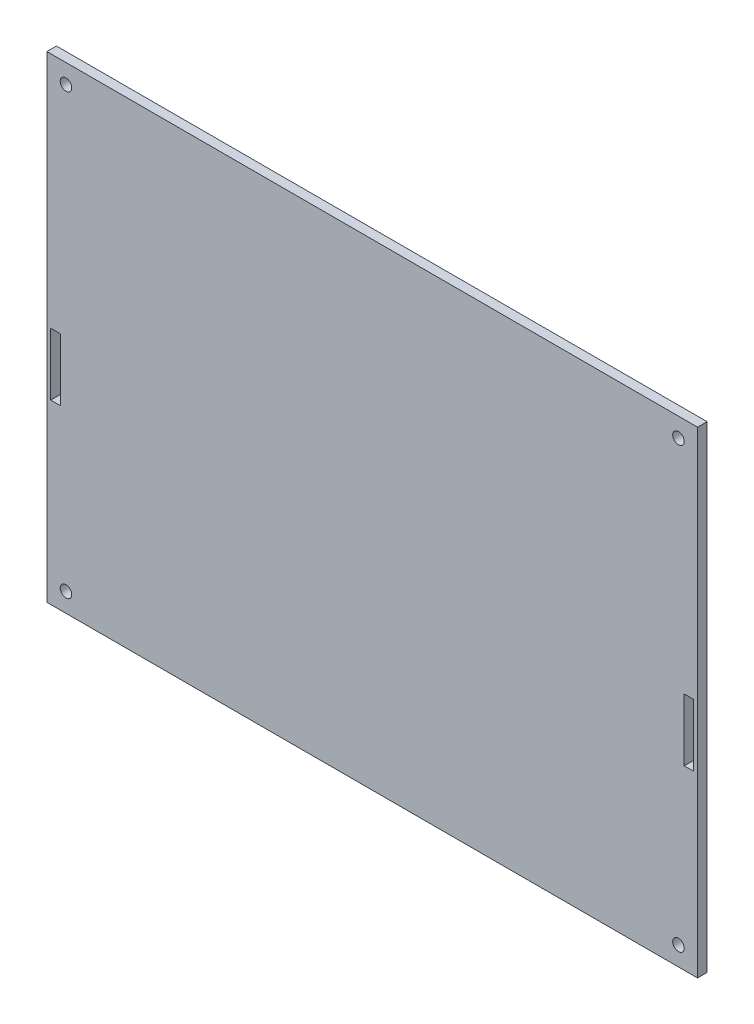
ISO-10303-21;
HEADER;
FILE_DESCRIPTION(('STEP AP214'),'2;1');
FILE_NAME('part.step','',(''),(''),'','','');
FILE_SCHEMA(('AUTOMOTIVE_DESIGN { 1 0 10303 214 1 1 1 1 }'));
ENDSEC;
DATA;
#1=APPLICATION_CONTEXT('core data for automotive mechanical design processes');
#2=APPLICATION_PROTOCOL_DEFINITION('international standard','automotive_design',2000,#1);
#3=PRODUCT_CONTEXT('',#1,'mechanical');
#4=PRODUCT('Part','Part','',(#3));
#5=PRODUCT_RELATED_PRODUCT_CATEGORY('part','',(#4));
#6=PRODUCT_DEFINITION_FORMATION('','',#4);
#7=PRODUCT_DEFINITION_CONTEXT('part definition',#1,'design');
#8=PRODUCT_DEFINITION('design','',#6,#7);
#9=PRODUCT_DEFINITION_SHAPE('','',#8);
#10=(LENGTH_UNIT() NAMED_UNIT(*) SI_UNIT(.MILLI.,.METRE.));
#11=(NAMED_UNIT(*) PLANE_ANGLE_UNIT() SI_UNIT($,.RADIAN.));
#12=(NAMED_UNIT(*) SI_UNIT($,.STERADIAN.) SOLID_ANGLE_UNIT());
#13=UNCERTAINTY_MEASURE_WITH_UNIT(LENGTH_MEASURE(1.E-05),#10,'distance_accuracy_value','');
#14=(GEOMETRIC_REPRESENTATION_CONTEXT(3) GLOBAL_UNCERTAINTY_ASSIGNED_CONTEXT((#13)) GLOBAL_UNIT_ASSIGNED_CONTEXT((#10,
#11,#12)) REPRESENTATION_CONTEXT('',''));
#15=CARTESIAN_POINT('',(0.,0.,0.));
#16=DIRECTION('',(0.,0.,1.));
#17=DIRECTION('',(1.,0.,0.));
#18=AXIS2_PLACEMENT_3D('',#15,#16,#17);
#19=CARTESIAN_POINT('',(0.,0.,5.));
#20=DIRECTION('',(0.,0.,-1.));
#21=DIRECTION('',(-1.,0.,0.));
#22=AXIS2_PLACEMENT_3D('',#19,#20,#21);
#23=PLANE('',#22);
#24=CARTESIAN_POINT('',(321.000000000002,-1.90060640836709E-12,5.));
#25=DIRECTION('',(0.,0.,1.));
#26=DIRECTION('',(1.,0.,0.));
#27=AXIS2_PLACEMENT_3D('',#24,#25,#26);
#28=CIRCLE('',#27,3.02500000000001);
#29=CARTESIAN_POINT('',(324.025000000002,-1.90060640836709E-12,5.));
#30=VERTEX_POINT('',#29);
#31=EDGE_CURVE('E165',#30,#30,#28,.T.);
#32=ORIENTED_EDGE('',*,*,#31,.F.);
#33=EDGE_LOOP('',(#32));
#34=FACE_BOUND('',#33,.T.);
#35=CARTESIAN_POINT('',(0.,0.,5.));
#36=DIRECTION('',(0.,0.,1.));
#37=DIRECTION('',(1.,0.,0.));
#38=AXIS2_PLACEMENT_3D('',#35,#36,#37);
#39=CIRCLE('',#38,3.025);
#40=CARTESIAN_POINT('',(3.025,0.,5.));
#41=VERTEX_POINT('',#40);
#42=EDGE_CURVE('E171',#41,#41,#39,.T.);
#43=ORIENTED_EDGE('',*,*,#42,.F.);
#44=EDGE_LOOP('',(#43));
#45=FACE_BOUND('',#44,.T.);
#46=CARTESIAN_POINT('',(0.,-229.999999999997,5.));
#47=DIRECTION('',(0.,0.,1.));
#48=DIRECTION('',(1.,0.,0.));
#49=AXIS2_PLACEMENT_3D('',#46,#47,#48);
#50=CIRCLE('',#49,3.025);
#51=CARTESIAN_POINT('',(3.02500000000003,-229.999999999997,5.));
#52=VERTEX_POINT('',#51);
#53=EDGE_CURVE('E177',#52,#52,#50,.T.);
#54=ORIENTED_EDGE('',*,*,#53,.F.);
#55=EDGE_LOOP('',(#54));
#56=FACE_BOUND('',#55,.T.);
#57=DIRECTION('',(-1.,0.,0.));
#58=VECTOR('',#57,1.);
#59=CARTESIAN_POINT('',(324.,-114.60000000018,5.));
#60=LINE('',#59,#58);
#61=CARTESIAN_POINT('',(329.,-114.60000000018,5.));
#62=VERTEX_POINT('',#61);
#63=CARTESIAN_POINT('',(324.,-114.60000000018,5.));
#64=VERTEX_POINT('',#63);
#65=EDGE_CURVE('E183',#62,#64,#60,.T.);
#66=ORIENTED_EDGE('',*,*,#65,.F.);
#67=DIRECTION('',(0.,1.,0.));
#68=VECTOR('',#67,1.);
#69=CARTESIAN_POINT('',(329.,-114.60000000018,5.));
#70=LINE('',#69,#68);
#71=CARTESIAN_POINT('',(329.,-147.205939298235,5.));
#72=VERTEX_POINT('',#71);
#73=EDGE_CURVE('E191',#72,#62,#70,.T.);
#74=ORIENTED_EDGE('',*,*,#73,.F.);
#75=DIRECTION('',(1.,0.,0.));
#76=VECTOR('',#75,1.);
#77=CARTESIAN_POINT('',(324.,-147.205939298235,5.));
#78=LINE('',#77,#76);
#79=CARTESIAN_POINT('',(324.,-147.205939298235,5.));
#80=VERTEX_POINT('',#79);
#81=EDGE_CURVE('E188',#80,#72,#78,.T.);
#82=ORIENTED_EDGE('',*,*,#81,.F.);
#83=DIRECTION('',(0.,-1.,0.));
#84=VECTOR('',#83,1.);
#85=CARTESIAN_POINT('',(324.,-114.60000000018,5.));
#86=LINE('',#85,#84);
#87=EDGE_CURVE('E185',#64,#80,#86,.T.);
#88=ORIENTED_EDGE('',*,*,#87,.F.);
#89=EDGE_LOOP('',(#66,#74,#82,#88));
#90=FACE_BOUND('',#89,.T.);
#91=DIRECTION('',(0.,1.,0.));
#92=VECTOR('',#91,1.);
#93=CARTESIAN_POINT('',(331.,10.0000000000033,5.));
#94=LINE('',#93,#92);
#95=CARTESIAN_POINT('',(331.,-239.999999999997,5.));
#96=VERTEX_POINT('',#95);
#97=CARTESIAN_POINT('',(331.,10.0000000000033,5.));
#98=VERTEX_POINT('',#97);
#99=EDGE_CURVE('E214',#96,#98,#94,.T.);
#100=ORIENTED_EDGE('',*,*,#99,.T.);
#101=DIRECTION('',(-1.,0.,0.));
#102=VECTOR('',#101,1.);
#103=CARTESIAN_POINT('',(331.,10.0000000000033,5.));
#104=LINE('',#103,#102);
#105=CARTESIAN_POINT('',(-9.9999999999994,10.0000000000033,5.));
#106=VERTEX_POINT('',#105);
#107=EDGE_CURVE('E217',#98,#106,#104,.T.);
#108=ORIENTED_EDGE('',*,*,#107,.T.);
#109=DIRECTION('',(0.,-1.,0.));
#110=VECTOR('',#109,1.);
#111=CARTESIAN_POINT('',(-9.9999999999994,10.0000000000033,5.));
#112=LINE('',#111,#110);
#113=CARTESIAN_POINT('',(-9.99999999999942,-239.999999999997,5.));
#114=VERTEX_POINT('',#113);
#115=EDGE_CURVE('E220',#106,#114,#112,.T.);
#116=ORIENTED_EDGE('',*,*,#115,.T.);
#117=DIRECTION('',(1.,0.,0.));
#118=VECTOR('',#117,1.);
#119=CARTESIAN_POINT('',(331.,-239.999999999997,5.));
#120=LINE('',#119,#118);
#121=EDGE_CURVE('E222',#114,#96,#120,.T.);
#122=ORIENTED_EDGE('',*,*,#121,.T.);
#123=EDGE_LOOP('',(#100,#108,#116,#122));
#124=FACE_BOUND('',#123,.T.);
#125=DIRECTION('',(0.,1.,0.));
#126=VECTOR('',#125,1.);
#127=CARTESIAN_POINT('',(-3.00000000000006,-114.600000000179,5.));
#128=LINE('',#127,#126);
#129=CARTESIAN_POINT('',(-3.00000000000006,-147.205939298235,5.));
#130=VERTEX_POINT('',#129);
#131=CARTESIAN_POINT('',(-3.00000000000006,-114.600000000179,5.));
#132=VERTEX_POINT('',#131);
#133=EDGE_CURVE('E126',#130,#132,#128,.T.);
#134=ORIENTED_EDGE('',*,*,#133,.F.);
#135=DIRECTION('',(1.,0.,0.));
#136=VECTOR('',#135,1.);
#137=CARTESIAN_POINT('',(-3.00000000000006,-147.205939298235,5.));
#138=LINE('',#137,#136);
#139=CARTESIAN_POINT('',(-8.00000000000001,-147.205939298235,5.));
#140=VERTEX_POINT('',#139);
#141=EDGE_CURVE('E149',#140,#130,#138,.T.);
#142=ORIENTED_EDGE('',*,*,#141,.F.);
#143=DIRECTION('',(0.,-1.,0.));
#144=VECTOR('',#143,1.);
#145=CARTESIAN_POINT('',(-8.00000000000001,-114.600000000179,5.));
#146=LINE('',#145,#144);
#147=CARTESIAN_POINT('',(-8.00000000000001,-114.600000000179,5.));
#148=VERTEX_POINT('',#147);
#149=EDGE_CURVE('E147',#148,#140,#146,.T.);
#150=ORIENTED_EDGE('',*,*,#149,.F.);
#151=DIRECTION('',(-1.,0.,0.));
#152=VECTOR('',#151,1.);
#153=CARTESIAN_POINT('',(-3.00000000000006,-114.600000000179,5.));
#154=LINE('',#153,#152);
#155=EDGE_CURVE('E134',#132,#148,#154,.T.);
#156=ORIENTED_EDGE('',*,*,#155,.F.);
#157=EDGE_LOOP('',(#134,#142,#150,#156));
#158=FACE_BOUND('',#157,.T.);
#159=CARTESIAN_POINT('',(321.000000000002,-229.999999999995,5.));
#160=DIRECTION('',(0.,0.,1.));
#161=DIRECTION('',(1.,0.,0.));
#162=AXIS2_PLACEMENT_3D('',#159,#160,#161);
#163=CIRCLE('',#162,3.02500000000001);
#164=CARTESIAN_POINT('',(324.025000000002,-229.999999999995,5.));
#165=VERTEX_POINT('',#164);
#166=EDGE_CURVE('E155',#165,#165,#163,.T.);
#167=ORIENTED_EDGE('',*,*,#166,.F.);
#168=EDGE_LOOP('',(#167));
#169=FACE_BOUND('',#168,.T.);
#170=ADVANCED_FACE('F37',(#34,#45,#56,#90,#124,#158,#169),#23,.F.);
#171=CARTESIAN_POINT('',(0.,0.,0.));
#172=DIRECTION('',(0.,0.,-1.));
#173=DIRECTION('',(-1.,0.,0.));
#174=AXIS2_PLACEMENT_3D('',#171,#172,#173);
#175=PLANE('',#174);
#176=DIRECTION('',(1.,0.,0.));
#177=VECTOR('',#176,1.);
#178=CARTESIAN_POINT('',(-3.00000000000006,-147.205939298235,0.));
#179=LINE('',#178,#177);
#180=CARTESIAN_POINT('',(-8.00000000000001,-147.205939298235,0.));
#181=VERTEX_POINT('',#180);
#182=CARTESIAN_POINT('',(-3.00000000000006,-147.205939298235,0.));
#183=VERTEX_POINT('',#182);
#184=EDGE_CURVE('E135',#181,#183,#179,.T.);
#185=ORIENTED_EDGE('',*,*,#184,.T.);
#186=DIRECTION('',(0.,1.,0.));
#187=VECTOR('',#186,1.);
#188=CARTESIAN_POINT('',(-3.00000000000006,-114.600000000179,0.));
#189=LINE('',#188,#187);
#190=CARTESIAN_POINT('',(-3.00000000000006,-114.600000000179,0.));
#191=VERTEX_POINT('',#190);
#192=EDGE_CURVE('E60',#183,#191,#189,.T.);
#193=ORIENTED_EDGE('',*,*,#192,.T.);
#194=DIRECTION('',(-1.,0.,0.));
#195=VECTOR('',#194,1.);
#196=CARTESIAN_POINT('',(-3.00000000000006,-114.600000000179,0.));
#197=LINE('',#196,#195);
#198=CARTESIAN_POINT('',(-8.00000000000001,-114.600000000179,0.));
#199=VERTEX_POINT('',#198);
#200=EDGE_CURVE('E141',#191,#199,#197,.T.);
#201=ORIENTED_EDGE('',*,*,#200,.T.);
#202=DIRECTION('',(0.,-1.,0.));
#203=VECTOR('',#202,1.);
#204=CARTESIAN_POINT('',(-8.00000000000001,-114.600000000179,0.));
#205=LINE('',#204,#203);
#206=EDGE_CURVE('E157',#199,#181,#205,.T.);
#207=ORIENTED_EDGE('',*,*,#206,.T.);
#208=EDGE_LOOP('',(#185,#193,#201,#207));
#209=FACE_BOUND('',#208,.T.);
#210=CARTESIAN_POINT('',(321.000000000002,-1.90060640836709E-12,0.));
#211=DIRECTION('',(0.,0.,1.));
#212=DIRECTION('',(1.,0.,0.));
#213=AXIS2_PLACEMENT_3D('',#210,#211,#212);
#214=CIRCLE('',#213,3.02500000000001);
#215=CARTESIAN_POINT('',(324.025000000002,-1.90060640836709E-12,0.));
#216=VERTEX_POINT('',#215);
#217=EDGE_CURVE('E142',#216,#216,#214,.T.);
#218=ORIENTED_EDGE('',*,*,#217,.T.);
#219=EDGE_LOOP('',(#218));
#220=FACE_BOUND('',#219,.T.);
#221=CARTESIAN_POINT('',(0.,-229.999999999997,0.));
#222=DIRECTION('',(0.,0.,1.));
#223=DIRECTION('',(1.,0.,0.));
#224=AXIS2_PLACEMENT_3D('',#221,#222,#223);
#225=CIRCLE('',#224,3.025);
#226=CARTESIAN_POINT('',(3.02500000000003,-229.999999999997,0.));
#227=VERTEX_POINT('',#226);
#228=EDGE_CURVE('E174',#227,#227,#225,.T.);
#229=ORIENTED_EDGE('',*,*,#228,.T.);
#230=EDGE_LOOP('',(#229));
#231=FACE_BOUND('',#230,.T.);
#232=DIRECTION('',(0.,1.,0.));
#233=VECTOR('',#232,1.);
#234=CARTESIAN_POINT('',(331.,10.0000000000033,0.));
#235=LINE('',#234,#233);
#236=CARTESIAN_POINT('',(331.,-239.999999999997,0.));
#237=VERTEX_POINT('',#236);
#238=CARTESIAN_POINT('',(331.,10.0000000000033,0.));
#239=VERTEX_POINT('',#238);
#240=EDGE_CURVE('E213',#237,#239,#235,.T.);
#241=ORIENTED_EDGE('',*,*,#240,.F.);
#242=DIRECTION('',(1.,0.,0.));
#243=VECTOR('',#242,1.);
#244=CARTESIAN_POINT('',(331.,-239.999999999997,0.));
#245=LINE('',#244,#243);
#246=CARTESIAN_POINT('',(-9.99999999999942,-239.999999999997,0.));
#247=VERTEX_POINT('',#246);
#248=EDGE_CURVE('E218',#247,#237,#245,.T.);
#249=ORIENTED_EDGE('',*,*,#248,.F.);
#250=DIRECTION('',(0.,-1.,0.));
#251=VECTOR('',#250,1.);
#252=CARTESIAN_POINT('',(-9.9999999999994,10.0000000000033,0.));
#253=LINE('',#252,#251);
#254=CARTESIAN_POINT('',(-9.9999999999994,10.0000000000033,0.));
#255=VERTEX_POINT('',#254);
#256=EDGE_CURVE('E229',#255,#247,#253,.T.);
#257=ORIENTED_EDGE('',*,*,#256,.F.);
#258=DIRECTION('',(-1.,0.,0.));
#259=VECTOR('',#258,1.);
#260=CARTESIAN_POINT('',(331.,10.0000000000033,0.));
#261=LINE('',#260,#259);
#262=EDGE_CURVE('E227',#239,#255,#261,.T.);
#263=ORIENTED_EDGE('',*,*,#262,.F.);
#264=EDGE_LOOP('',(#241,#249,#257,#263));
#265=FACE_BOUND('',#264,.T.);
#266=DIRECTION('',(0.,1.,0.));
#267=VECTOR('',#266,1.);
#268=CARTESIAN_POINT('',(329.,-114.60000000018,0.));
#269=LINE('',#268,#267);
#270=CARTESIAN_POINT('',(329.,-147.205939298235,0.));
#271=VERTEX_POINT('',#270);
#272=CARTESIAN_POINT('',(329.,-114.60000000018,0.));
#273=VERTEX_POINT('',#272);
#274=EDGE_CURVE('E186',#271,#273,#269,.T.);
#275=ORIENTED_EDGE('',*,*,#274,.T.);
#276=DIRECTION('',(-1.,0.,0.));
#277=VECTOR('',#276,1.);
#278=CARTESIAN_POINT('',(324.,-114.60000000018,0.));
#279=LINE('',#278,#277);
#280=CARTESIAN_POINT('',(324.,-114.60000000018,0.));
#281=VERTEX_POINT('',#280);
#282=EDGE_CURVE('E180',#273,#281,#279,.T.);
#283=ORIENTED_EDGE('',*,*,#282,.T.);
#284=DIRECTION('',(0.,-1.,0.));
#285=VECTOR('',#284,1.);
#286=CARTESIAN_POINT('',(324.,-114.60000000018,0.));
#287=LINE('',#286,#285);
#288=CARTESIAN_POINT('',(324.,-147.205939298235,0.));
#289=VERTEX_POINT('',#288);
#290=EDGE_CURVE('E196',#281,#289,#287,.T.);
#291=ORIENTED_EDGE('',*,*,#290,.T.);
#292=DIRECTION('',(1.,0.,0.));
#293=VECTOR('',#292,1.);
#294=CARTESIAN_POINT('',(324.,-147.205939298235,0.));
#295=LINE('',#294,#293);
#296=EDGE_CURVE('E199',#289,#271,#295,.T.);
#297=ORIENTED_EDGE('',*,*,#296,.T.);
#298=EDGE_LOOP('',(#275,#283,#291,#297));
#299=FACE_BOUND('',#298,.T.);
#300=CARTESIAN_POINT('',(0.,0.,0.));
#301=DIRECTION('',(0.,0.,1.));
#302=DIRECTION('',(1.,0.,0.));
#303=AXIS2_PLACEMENT_3D('',#300,#301,#302);
#304=CIRCLE('',#303,3.025);
#305=CARTESIAN_POINT('',(3.025,0.,0.));
#306=VERTEX_POINT('',#305);
#307=EDGE_CURVE('E168',#306,#306,#304,.T.);
#308=ORIENTED_EDGE('',*,*,#307,.T.);
#309=EDGE_LOOP('',(#308));
#310=FACE_BOUND('',#309,.T.);
#311=CARTESIAN_POINT('',(321.000000000002,-229.999999999995,0.));
#312=DIRECTION('',(0.,0.,1.));
#313=DIRECTION('',(1.,0.,0.));
#314=AXIS2_PLACEMENT_3D('',#311,#312,#313);
#315=CIRCLE('',#314,3.02500000000001);
#316=CARTESIAN_POINT('',(324.025000000002,-229.999999999995,0.));
#317=VERTEX_POINT('',#316);
#318=EDGE_CURVE('E343',#317,#317,#315,.T.);
#319=ORIENTED_EDGE('',*,*,#318,.T.);
#320=EDGE_LOOP('',(#319));
#321=FACE_BOUND('',#320,.T.);
#322=ADVANCED_FACE('F247',(#209,#220,#231,#265,#299,#310,#321),#175,.T.);
#323=CARTESIAN_POINT('',(331.,10.0000000000033,5.));
#324=DIRECTION('',(-1.,0.,0.));
#325=DIRECTION('',(0.,-1.,0.));
#326=AXIS2_PLACEMENT_3D('',#323,#324,#325);
#327=PLANE('',#326);
#328=ORIENTED_EDGE('',*,*,#240,.T.);
#329=DIRECTION('',(0.,0.,-1.));
#330=VECTOR('',#329,1.);
#331=CARTESIAN_POINT('',(331.,10.0000000000033,5.));
#332=LINE('',#331,#330);
#333=EDGE_CURVE('E11',#98,#239,#332,.T.);
#334=ORIENTED_EDGE('',*,*,#333,.F.);
#335=ORIENTED_EDGE('',*,*,#99,.F.);
#336=DIRECTION('',(0.,0.,-1.));
#337=VECTOR('',#336,1.);
#338=CARTESIAN_POINT('',(331.,-239.999999999997,5.));
#339=LINE('',#338,#337);
#340=EDGE_CURVE('E224',#96,#237,#339,.T.);
#341=ORIENTED_EDGE('',*,*,#340,.T.);
#342=EDGE_LOOP('',(#328,#334,#335,#341));
#343=FACE_BOUND('',#342,.T.);
#344=ADVANCED_FACE('F39',(#343),#327,.F.);
#345=CARTESIAN_POINT('',(331.,10.0000000000033,5.));
#346=DIRECTION('',(0.,-1.,0.));
#347=DIRECTION('',(1.,0.,0.));
#348=AXIS2_PLACEMENT_3D('',#345,#346,#347);
#349=PLANE('',#348);
#350=ORIENTED_EDGE('',*,*,#262,.T.);
#351=DIRECTION('',(0.,0.,-1.));
#352=VECTOR('',#351,1.);
#353=CARTESIAN_POINT('',(-9.9999999999994,10.0000000000033,5.));
#354=LINE('',#353,#352);
#355=EDGE_CURVE('E45',#106,#255,#354,.T.);
#356=ORIENTED_EDGE('',*,*,#355,.F.);
#357=ORIENTED_EDGE('',*,*,#107,.F.);
#358=ORIENTED_EDGE('',*,*,#333,.T.);
#359=EDGE_LOOP('',(#350,#356,#357,#358));
#360=FACE_BOUND('',#359,.T.);
#361=ADVANCED_FACE('F257',(#360),#349,.F.);
#362=CARTESIAN_POINT('',(-9.9999999999994,10.0000000000033,5.));
#363=DIRECTION('',(1.,0.,0.));
#364=DIRECTION('',(0.,1.,0.));
#365=AXIS2_PLACEMENT_3D('',#362,#363,#364);
#366=PLANE('',#365);
#367=ORIENTED_EDGE('',*,*,#256,.T.);
#368=DIRECTION('',(0.,0.,-1.));
#369=VECTOR('',#368,1.);
#370=CARTESIAN_POINT('',(-9.99999999999942,-239.999999999997,5.));
#371=LINE('',#370,#369);
#372=EDGE_CURVE('E234',#114,#247,#371,.T.);
#373=ORIENTED_EDGE('',*,*,#372,.F.);
#374=ORIENTED_EDGE('',*,*,#115,.F.);
#375=ORIENTED_EDGE('',*,*,#355,.T.);
#376=EDGE_LOOP('',(#367,#373,#374,#375));
#377=FACE_BOUND('',#376,.T.);
#378=ADVANCED_FACE('F241',(#377),#366,.F.);
#379=CARTESIAN_POINT('',(331.,-239.999999999997,5.));
#380=DIRECTION('',(0.,1.,0.));
#381=DIRECTION('',(0.,0.,1.));
#382=AXIS2_PLACEMENT_3D('',#379,#380,#381);
#383=PLANE('',#382);
#384=ORIENTED_EDGE('',*,*,#248,.T.);
#385=ORIENTED_EDGE('',*,*,#340,.F.);
#386=ORIENTED_EDGE('',*,*,#121,.F.);
#387=ORIENTED_EDGE('',*,*,#372,.T.);
#388=EDGE_LOOP('',(#384,#385,#386,#387));
#389=FACE_BOUND('',#388,.T.);
#390=ADVANCED_FACE('F251',(#389),#383,.F.);
#391=CARTESIAN_POINT('',(324.,-114.60000000018,5.));
#392=DIRECTION('',(0.,-1.,0.));
#393=DIRECTION('',(0.,0.,-1.));
#394=AXIS2_PLACEMENT_3D('',#391,#392,#393);
#395=PLANE('',#394);
#396=ORIENTED_EDGE('',*,*,#282,.F.);
#397=DIRECTION('',(0.,0.,-1.));
#398=VECTOR('',#397,1.);
#399=CARTESIAN_POINT('',(329.,-114.60000000018,5.));
#400=LINE('',#399,#398);
#401=EDGE_CURVE('E193',#62,#273,#400,.T.);
#402=ORIENTED_EDGE('',*,*,#401,.F.);
#403=ORIENTED_EDGE('',*,*,#65,.T.);
#404=DIRECTION('',(0.,0.,-1.));
#405=VECTOR('',#404,1.);
#406=CARTESIAN_POINT('',(324.,-114.60000000018,5.));
#407=LINE('',#406,#405);
#408=EDGE_CURVE('E210',#64,#281,#407,.T.);
#409=ORIENTED_EDGE('',*,*,#408,.T.);
#410=EDGE_LOOP('',(#396,#402,#403,#409));
#411=FACE_BOUND('',#410,.T.);
#412=ADVANCED_FACE('F275',(#411),#395,.T.);
#413=CARTESIAN_POINT('',(324.,-114.60000000018,5.));
#414=DIRECTION('',(1.,0.,0.));
#415=DIRECTION('',(0.,0.,-1.));
#416=AXIS2_PLACEMENT_3D('',#413,#414,#415);
#417=PLANE('',#416);
#418=ORIENTED_EDGE('',*,*,#290,.F.);
#419=ORIENTED_EDGE('',*,*,#408,.F.);
#420=ORIENTED_EDGE('',*,*,#87,.T.);
#421=DIRECTION('',(0.,0.,-1.));
#422=VECTOR('',#421,1.);
#423=CARTESIAN_POINT('',(324.,-147.205939298235,5.));
#424=LINE('',#423,#422);
#425=EDGE_CURVE('E208',#80,#289,#424,.T.);
#426=ORIENTED_EDGE('',*,*,#425,.T.);
#427=EDGE_LOOP('',(#418,#419,#420,#426));
#428=FACE_BOUND('',#427,.T.);
#429=ADVANCED_FACE('F282',(#428),#417,.T.);
#430=CARTESIAN_POINT('',(324.,-147.205939298235,5.));
#431=DIRECTION('',(0.,1.,0.));
#432=DIRECTION('',(0.,0.,1.));
#433=AXIS2_PLACEMENT_3D('',#430,#431,#432);
#434=PLANE('',#433);
#435=ORIENTED_EDGE('',*,*,#296,.F.);
#436=ORIENTED_EDGE('',*,*,#425,.F.);
#437=ORIENTED_EDGE('',*,*,#81,.T.);
#438=DIRECTION('',(0.,0.,-1.));
#439=VECTOR('',#438,1.);
#440=CARTESIAN_POINT('',(329.,-147.205939298235,5.));
#441=LINE('',#440,#439);
#442=EDGE_CURVE('E206',#72,#271,#441,.T.);
#443=ORIENTED_EDGE('',*,*,#442,.T.);
#444=EDGE_LOOP('',(#435,#436,#437,#443));
#445=FACE_BOUND('',#444,.T.);
#446=ADVANCED_FACE('F287',(#445),#434,.T.);
#447=CARTESIAN_POINT('',(329.,-114.60000000018,5.));
#448=DIRECTION('',(-1.,0.,0.));
#449=DIRECTION('',(0.,0.,1.));
#450=AXIS2_PLACEMENT_3D('',#447,#448,#449);
#451=PLANE('',#450);
#452=ORIENTED_EDGE('',*,*,#274,.F.);
#453=ORIENTED_EDGE('',*,*,#442,.F.);
#454=ORIENTED_EDGE('',*,*,#73,.T.);
#455=ORIENTED_EDGE('',*,*,#401,.T.);
#456=EDGE_LOOP('',(#452,#453,#454,#455));
#457=FACE_BOUND('',#456,.T.);
#458=ADVANCED_FACE('F294',(#457),#451,.T.);
#459=CARTESIAN_POINT('',(0.,-229.999999999997,5.));
#460=DIRECTION('',(0.,0.,-1.));
#461=DIRECTION('',(-1.,0.,0.));
#462=AXIS2_PLACEMENT_3D('',#459,#460,#461);
#463=CYLINDRICAL_SURFACE('',#462,3.025);
#464=ORIENTED_EDGE('',*,*,#53,.T.);
#465=EDGE_LOOP('',(#464));
#466=FACE_BOUND('',#465,.T.);
#467=ORIENTED_EDGE('',*,*,#228,.F.);
#468=EDGE_LOOP('',(#467));
#469=FACE_BOUND('',#468,.T.);
#470=ADVANCED_FACE('F308',(#466,#469),#463,.F.);
#471=CARTESIAN_POINT('',(0.,0.,5.));
#472=DIRECTION('',(0.,0.,-1.));
#473=DIRECTION('',(-1.,0.,0.));
#474=AXIS2_PLACEMENT_3D('',#471,#472,#473);
#475=CYLINDRICAL_SURFACE('',#474,3.025);
#476=ORIENTED_EDGE('',*,*,#42,.T.);
#477=EDGE_LOOP('',(#476));
#478=FACE_BOUND('',#477,.T.);
#479=ORIENTED_EDGE('',*,*,#307,.F.);
#480=EDGE_LOOP('',(#479));
#481=FACE_BOUND('',#480,.T.);
#482=ADVANCED_FACE('F313',(#478,#481),#475,.F.);
#483=CARTESIAN_POINT('',(321.000000000002,-1.90060640836709E-12,5.));
#484=DIRECTION('',(0.,0.,-1.));
#485=DIRECTION('',(-1.,0.,0.));
#486=AXIS2_PLACEMENT_3D('',#483,#484,#485);
#487=CYLINDRICAL_SURFACE('',#486,3.02500000000001);
#488=ORIENTED_EDGE('',*,*,#31,.T.);
#489=EDGE_LOOP('',(#488));
#490=FACE_BOUND('',#489,.T.);
#491=ORIENTED_EDGE('',*,*,#217,.F.);
#492=EDGE_LOOP('',(#491));
#493=FACE_BOUND('',#492,.T.);
#494=ADVANCED_FACE('F317',(#490,#493),#487,.F.);
#495=CARTESIAN_POINT('',(-3.00000000000006,-114.600000000179,5.));
#496=DIRECTION('',(-1.,0.,0.));
#497=DIRECTION('',(0.,0.,1.));
#498=AXIS2_PLACEMENT_3D('',#495,#496,#497);
#499=PLANE('',#498);
#500=ORIENTED_EDGE('',*,*,#192,.F.);
#501=DIRECTION('',(0.,0.,-1.));
#502=VECTOR('',#501,1.);
#503=CARTESIAN_POINT('',(-3.00000000000006,-147.205939298235,5.));
#504=LINE('',#503,#502);
#505=EDGE_CURVE('E130',#130,#183,#504,.T.);
#506=ORIENTED_EDGE('',*,*,#505,.F.);
#507=ORIENTED_EDGE('',*,*,#133,.T.);
#508=DIRECTION('',(0.,0.,-1.));
#509=VECTOR('',#508,1.);
#510=CARTESIAN_POINT('',(-3.00000000000006,-114.600000000179,5.));
#511=LINE('',#510,#509);
#512=EDGE_CURVE('E129',#132,#191,#511,.T.);
#513=ORIENTED_EDGE('',*,*,#512,.T.);
#514=EDGE_LOOP('',(#500,#506,#507,#513));
#515=FACE_BOUND('',#514,.T.);
#516=ADVANCED_FACE('F128',(#515),#499,.T.);
#517=CARTESIAN_POINT('',(-3.00000000000006,-114.600000000179,5.));
#518=DIRECTION('',(0.,-1.,0.));
#519=DIRECTION('',(0.,0.,-1.));
#520=AXIS2_PLACEMENT_3D('',#517,#518,#519);
#521=PLANE('',#520);
#522=ORIENTED_EDGE('',*,*,#200,.F.);
#523=ORIENTED_EDGE('',*,*,#512,.F.);
#524=ORIENTED_EDGE('',*,*,#155,.T.);
#525=DIRECTION('',(0.,0.,-1.));
#526=VECTOR('',#525,1.);
#527=CARTESIAN_POINT('',(-8.00000000000001,-114.600000000179,5.));
#528=LINE('',#527,#526);
#529=EDGE_CURVE('E143',#148,#199,#528,.T.);
#530=ORIENTED_EDGE('',*,*,#529,.T.);
#531=EDGE_LOOP('',(#522,#523,#524,#530));
#532=FACE_BOUND('',#531,.T.);
#533=ADVANCED_FACE('F138',(#532),#521,.T.);
#534=CARTESIAN_POINT('',(-8.00000000000001,-114.600000000179,5.));
#535=DIRECTION('',(1.,0.,0.));
#536=DIRECTION('',(0.,0.,-1.));
#537=AXIS2_PLACEMENT_3D('',#534,#535,#536);
#538=PLANE('',#537);
#539=ORIENTED_EDGE('',*,*,#206,.F.);
#540=ORIENTED_EDGE('',*,*,#529,.F.);
#541=ORIENTED_EDGE('',*,*,#149,.T.);
#542=DIRECTION('',(0.,0.,-1.));
#543=VECTOR('',#542,1.);
#544=CARTESIAN_POINT('',(-8.00000000000001,-147.205939298235,5.));
#545=LINE('',#544,#543);
#546=EDGE_CURVE('E52',#140,#181,#545,.T.);
#547=ORIENTED_EDGE('',*,*,#546,.T.);
#548=EDGE_LOOP('',(#539,#540,#541,#547));
#549=FACE_BOUND('',#548,.T.);
#550=ADVANCED_FACE('F326',(#549),#538,.T.);
#551=CARTESIAN_POINT('',(-3.00000000000006,-147.205939298235,5.));
#552=DIRECTION('',(0.,1.,0.));
#553=DIRECTION('',(0.,0.,1.));
#554=AXIS2_PLACEMENT_3D('',#551,#552,#553);
#555=PLANE('',#554);
#556=ORIENTED_EDGE('',*,*,#184,.F.);
#557=ORIENTED_EDGE('',*,*,#546,.F.);
#558=ORIENTED_EDGE('',*,*,#141,.T.);
#559=ORIENTED_EDGE('',*,*,#505,.T.);
#560=EDGE_LOOP('',(#556,#557,#558,#559));
#561=FACE_BOUND('',#560,.T.);
#562=ADVANCED_FACE('F329',(#561),#555,.T.);
#563=CARTESIAN_POINT('',(321.000000000002,-229.999999999995,5.));
#564=DIRECTION('',(0.,0.,-1.));
#565=DIRECTION('',(-1.,0.,0.));
#566=AXIS2_PLACEMENT_3D('',#563,#564,#565);
#567=CYLINDRICAL_SURFACE('',#566,3.02500000000001);
#568=ORIENTED_EDGE('',*,*,#166,.T.);
#569=EDGE_LOOP('',(#568));
#570=FACE_BOUND('',#569,.T.);
#571=ORIENTED_EDGE('',*,*,#318,.F.);
#572=EDGE_LOOP('',(#571));
#573=FACE_BOUND('',#572,.T.);
#574=ADVANCED_FACE('F333',(#570,#573),#567,.F.);
#575=CLOSED_SHELL('',(#170,#322,#344,#361,#378,#390,#412,#429,#446,#458,#470,#482,#494,#516,
#533,#550,#562,#574));
#576=MANIFOLD_SOLID_BREP('B2',#575);
#577=ADVANCED_BREP_SHAPE_REPRESENTATION('',(#18,#576),#14);
#578=SHAPE_DEFINITION_REPRESENTATION(#9,#577);
ENDSEC;
END-ISO-10303-21;
